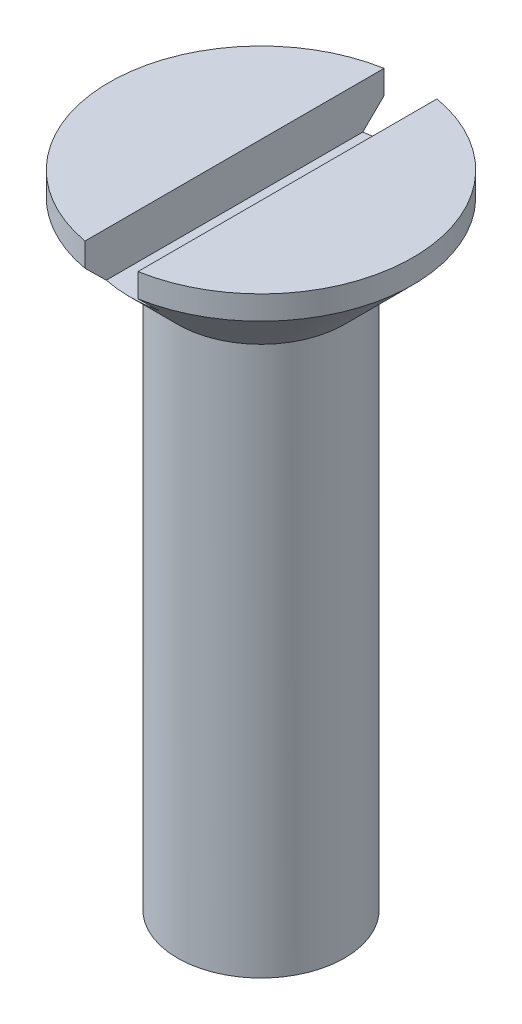
ISO-10303-21;
HEADER;
FILE_DESCRIPTION(('STEP AP214'),'2;1');
FILE_NAME('part.step','',(''),(''),'','','');
FILE_SCHEMA(('AUTOMOTIVE_DESIGN { 1 0 10303 214 1 1 1 1 }'));
ENDSEC;
DATA;
#1=APPLICATION_CONTEXT('core data for automotive mechanical design processes');
#2=APPLICATION_PROTOCOL_DEFINITION('international standard','automotive_design',2000,#1);
#3=PRODUCT_CONTEXT('',#1,'mechanical');
#4=PRODUCT('Part','Part','',(#3));
#5=PRODUCT_RELATED_PRODUCT_CATEGORY('part','',(#4));
#6=PRODUCT_DEFINITION_FORMATION('','',#4);
#7=PRODUCT_DEFINITION_CONTEXT('part definition',#1,'design');
#8=PRODUCT_DEFINITION('design','',#6,#7);
#9=PRODUCT_DEFINITION_SHAPE('','',#8);
#10=(LENGTH_UNIT() NAMED_UNIT(*) SI_UNIT(.MILLI.,.METRE.));
#11=(NAMED_UNIT(*) PLANE_ANGLE_UNIT() SI_UNIT($,.RADIAN.));
#12=(NAMED_UNIT(*) SI_UNIT($,.STERADIAN.) SOLID_ANGLE_UNIT());
#13=UNCERTAINTY_MEASURE_WITH_UNIT(LENGTH_MEASURE(1.E-05),#10,'distance_accuracy_value','');
#14=(GEOMETRIC_REPRESENTATION_CONTEXT(3) GLOBAL_UNCERTAINTY_ASSIGNED_CONTEXT((#13)) GLOBAL_UNIT_ASSIGNED_CONTEXT((#10,
#11,#12)) REPRESENTATION_CONTEXT('',''));
#15=CARTESIAN_POINT('',(0.,0.,0.));
#16=DIRECTION('',(0.,0.,1.));
#17=DIRECTION('',(1.,0.,0.));
#18=AXIS2_PLACEMENT_3D('',#15,#16,#17);
#19=CARTESIAN_POINT('',(0.,24.7320508075689,0.));
#20=DIRECTION('',(0.,1.,0.));
#21=DIRECTION('',(0.,0.,1.));
#22=AXIS2_PLACEMENT_3D('',#19,#20,#21);
#23=PLANE('',#22);
#24=DIRECTION('',(0.,0.,-1.));
#25=VECTOR('',#24,1.);
#26=CARTESIAN_POINT('',(0.95,24.7320508075689,-5.45));
#27=LINE('',#26,#25);
#28=CARTESIAN_POINT('',(0.95,24.7320508075689,5.3665631459995));
#29=VERTEX_POINT('',#28);
#30=CARTESIAN_POINT('',(0.95,24.7320508075689,-5.3665631459995));
#31=VERTEX_POINT('',#30);
#32=EDGE_CURVE('E156',#29,#31,#27,.T.);
#33=ORIENTED_EDGE('',*,*,#32,.F.);
#34=CARTESIAN_POINT('',(0.,24.7320508075689,0.));
#35=DIRECTION('',(0.,-1.,0.));
#36=DIRECTION('',(0.,0.,-1.));
#37=AXIS2_PLACEMENT_3D('',#34,#35,#36);
#38=CIRCLE('',#37,5.45);
#39=EDGE_CURVE('E104',#31,#29,#38,.T.);
#40=ORIENTED_EDGE('',*,*,#39,.F.);
#41=EDGE_LOOP('',(#33,#40));
#42=FACE_BOUND('',#41,.T.);
#43=ADVANCED_FACE('F37',(#42),#23,.T.);
#44=CARTESIAN_POINT('',(0.,0.,0.));
#45=DIRECTION('',(0.,-1.,0.));
#46=DIRECTION('',(0.,0.,-1.));
#47=AXIS2_PLACEMENT_3D('',#44,#45,#46);
#48=CYLINDRICAL_SURFACE('',#47,5.45);
#49=DIRECTION('',(0.,-1.,0.));
#50=VECTOR('',#49,1.);
#51=CARTESIAN_POINT('',(0.95,0.,5.3665631459995));
#52=LINE('',#51,#50);
#53=CARTESIAN_POINT('',(0.95,23.8820508075689,5.3665631459995));
#54=VERTEX_POINT('',#53);
#55=EDGE_CURVE('E152',#54,#29,#52,.F.);
#56=ORIENTED_EDGE('',*,*,#55,.F.);
#57=CARTESIAN_POINT('',(0.,23.8820508075689,0.));
#58=DIRECTION('',(0.,-1.,0.));
#59=DIRECTION('',(0.,0.,-1.));
#60=AXIS2_PLACEMENT_3D('',#57,#58,#59);
#61=CIRCLE('',#60,5.45);
#62=CARTESIAN_POINT('',(0.95,23.8820508075689,-5.3665631459995));
#63=VERTEX_POINT('',#62);
#64=EDGE_CURVE('E117',#63,#54,#61,.T.);
#65=ORIENTED_EDGE('',*,*,#64,.F.);
#66=DIRECTION('',(0.,-1.,0.));
#67=VECTOR('',#66,1.);
#68=CARTESIAN_POINT('',(0.95,0.,-5.3665631459995));
#69=LINE('',#68,#67);
#70=EDGE_CURVE('E153',#31,#63,#69,.T.);
#71=ORIENTED_EDGE('',*,*,#70,.F.);
#72=ORIENTED_EDGE('',*,*,#39,.T.);
#73=EDGE_LOOP('',(#56,#65,#71,#72));
#74=FACE_BOUND('',#73,.T.);
#75=ADVANCED_FACE('F151',(#74),#48,.T.);
#76=DIRECTION('',(0.,0.,1.));
#77=VECTOR('',#76,1.);
#78=CARTESIAN_POINT('',(-0.95,24.7320508075689,-5.45));
#79=LINE('',#78,#77);
#80=CARTESIAN_POINT('',(-0.95,24.7320508075689,-5.3665631459995));
#81=VERTEX_POINT('',#80);
#82=CARTESIAN_POINT('',(-0.95,24.7320508075689,5.3665631459995));
#83=VERTEX_POINT('',#82);
#84=EDGE_CURVE('E111',#81,#83,#79,.T.);
#85=ORIENTED_EDGE('',*,*,#84,.F.);
#86=EDGE_CURVE('E137',#83,#81,#38,.T.);
#87=ORIENTED_EDGE('',*,*,#86,.F.);
#88=EDGE_LOOP('',(#85,#87));
#89=FACE_BOUND('',#88,.T.);
#90=ADVANCED_FACE('F39',(#89),#23,.T.);
#91=DIRECTION('',(0.,-1.,0.));
#92=VECTOR('',#91,1.);
#93=CARTESIAN_POINT('',(-0.95,0.,-5.3665631459995));
#94=LINE('',#93,#92);
#95=CARTESIAN_POINT('',(-0.95,23.8820508075689,-5.3665631459995));
#96=VERTEX_POINT('',#95);
#97=EDGE_CURVE('E127',#96,#81,#94,.F.);
#98=ORIENTED_EDGE('',*,*,#97,.F.);
#99=CARTESIAN_POINT('',(-0.95,23.8820508075689,5.3665631459995));
#100=VERTEX_POINT('',#99);
#101=EDGE_CURVE('E135',#100,#96,#61,.T.);
#102=ORIENTED_EDGE('',*,*,#101,.F.);
#103=DIRECTION('',(0.,-1.,0.));
#104=VECTOR('',#103,1.);
#105=CARTESIAN_POINT('',(-0.95,0.,5.3665631459995));
#106=LINE('',#105,#104);
#107=EDGE_CURVE('E138',#83,#100,#106,.T.);
#108=ORIENTED_EDGE('',*,*,#107,.F.);
#109=ORIENTED_EDGE('',*,*,#86,.T.);
#110=EDGE_LOOP('',(#98,#102,#108,#109));
#111=FACE_BOUND('',#110,.T.);
#112=ADVANCED_FACE('F133',(#111),#48,.T.);
#113=CARTESIAN_POINT('',(0.,21.4320508075689,0.));
#114=DIRECTION('',(0.,1.,0.));
#115=DIRECTION('',(0.,0.,1.));
#116=AXIS2_PLACEMENT_3D('',#113,#114,#115);
#117=CONICAL_SURFACE('',#116,3.,0.785398163397443);
#118=CARTESIAN_POINT('',(0.95,23.8827508075689,-5.36727402784691));
#119=CARTESIAN_POINT('',(0.95,23.7386922721518,-5.22096942686692));
#120=CARTESIAN_POINT('',(0.95,23.594717816667,-5.07458190529039));
#121=CARTESIAN_POINT('',(0.95,23.3068609135357,-4.78142879407388));
#122=CARTESIAN_POINT('',(0.95,23.1629787018675,-4.63466297275422));
#123=CARTESIAN_POINT('',(0.95,22.8729592168232,-4.33821736729775));
#124=CARTESIAN_POINT('',(0.95,22.7268274090927,-4.18853223049867));
#125=CARTESIAN_POINT('',(0.95,22.435146779317,-3.88888624809531));
#126=CARTESIAN_POINT('',(0.95,22.2895975209458,-3.73892582684179));
#127=CARTESIAN_POINT('',(0.95,21.916193962948,-3.35268732026558));
#128=CARTESIAN_POINT('',(0.95,21.6887724862301,-3.11598875256886));
#129=CARTESIAN_POINT('',(0.95,21.3493161636398,-2.75849636400412));
#130=CARTESIAN_POINT('',(0.95,21.236233748065,-2.63869876965934));
#131=CARTESIAN_POINT('',(0.95,21.0111737581749,-2.3981635782147));
#132=CARTESIAN_POINT('',(0.95,20.8991957385827,-2.27742639827611));
#133=CARTESIAN_POINT('',(0.95,20.67853218465,-2.03630430512405));
#134=CARTESIAN_POINT('',(0.95,20.5698224677066,-1.91594166741531));
#135=CARTESIAN_POINT('',(0.95,20.4086407792311,-1.73355249406456));
#136=CARTESIAN_POINT('',(0.95,20.3551840995162,-1.67239741852466));
#137=CARTESIAN_POINT('',(0.95,20.249165055603,-1.54931822073712));
#138=CARTESIAN_POINT('',(0.95,20.1966026596036,-1.48739412597211));
#139=CARTESIAN_POINT('',(0.95,20.0930614832441,-1.36295298776711));
#140=CARTESIAN_POINT('',(0.95,20.0420742864828,-1.30044297031367));
#141=CARTESIAN_POINT('',(0.95,19.9418276633198,-1.17405781364909));
#142=CARTESIAN_POINT('',(0.95,19.8925679501324,-1.11018290388927));
#143=CARTESIAN_POINT('',(0.95,19.7967350308804,-0.980693167144421));
#144=CARTESIAN_POINT('',(0.95,19.7501552486259,-0.915083231273152));
#145=CARTESIAN_POINT('',(0.95,19.6609914342475,-0.781218199399263));
#146=CARTESIAN_POINT('',(0.95,19.618403216848,-0.71296598249865));
#147=CARTESIAN_POINT('',(0.95,19.5703966295173,-0.627290830226435));
#148=CARTESIAN_POINT('',(0.95,19.5618340282278,-0.611626968875247));
#149=CARTESIAN_POINT('',(0.95,19.5450800386999,-0.580097704625376));
#150=CARTESIAN_POINT('',(0.95,19.5368887334949,-0.564232257651601));
#151=CARTESIAN_POINT('',(0.95,19.5129403370542,-0.5163213457694));
#152=CARTESIAN_POINT('',(0.95,19.4978072513411,-0.483958640203391));
#153=CARTESIAN_POINT('',(0.95,19.4697969259773,-0.418661506764507));
#154=CARTESIAN_POINT('',(0.95,19.4568978648198,-0.38573652355217));
#155=CARTESIAN_POINT('',(0.95,19.4336823191761,-0.318972916981183));
#156=CARTESIAN_POINT('',(0.95,19.423365703705,-0.285134340057605));
#157=CARTESIAN_POINT('',(0.95,19.4076506612621,-0.223588326667061));
#158=CARTESIAN_POINT('',(0.95,19.4016792467842,-0.19602795395452));
#159=CARTESIAN_POINT('',(0.95,19.3919977769264,-0.140515145544492));
#160=CARTESIAN_POINT('',(0.95,19.3882870461112,-0.112562829505704));
#161=CARTESIAN_POINT('',(0.95,19.3833197960642,-0.0564821272998768));
#162=CARTESIAN_POINT('',(0.95,19.3820592916309,-0.0283541018134364));
#163=CARTESIAN_POINT('',(0.95,19.3820423759,0.0279054650456543));
#164=CARTESIAN_POINT('',(0.95,19.3832867874644,0.0560370045371295));
#165=CARTESIAN_POINT('',(0.95,19.3906963468661,0.139905474855344));
#166=CARTESIAN_POINT('',(0.95,19.4005174291714,0.195353553361763));
#167=CARTESIAN_POINT('',(0.95,19.4212392064539,0.276951858970861));
#168=CARTESIAN_POINT('',(0.95,19.4291644088802,0.30393587079854));
#169=CARTESIAN_POINT('',(0.95,19.4467256687551,0.357345323945092));
#170=CARTESIAN_POINT('',(0.95,19.456361666027,0.383770784874281));
#171=CARTESIAN_POINT('',(0.95,19.4957011628006,0.483109331771258));
#172=CARTESIAN_POINT('',(0.95,19.5303028877265,0.55407284224865));
#173=CARTESIAN_POINT('',(0.95,19.6061625731116,0.692377095293868));
#174=CARTESIAN_POINT('',(0.95,19.6474376281943,0.759707925194212));
#175=CARTESIAN_POINT('',(0.95,19.7343854179115,0.89223674683564));
#176=CARTESIAN_POINT('',(0.95,19.7800915767686,0.957412601266816));
#177=CARTESIAN_POINT('',(0.95,19.8505882475633,1.05366873930194));
#178=CARTESIAN_POINT('',(0.95,19.8743949875735,1.08548396626284));
#179=CARTESIAN_POINT('',(0.95,19.922551488408,1.14870022001975));
#180=CARTESIAN_POINT('',(0.95,19.9469012306485,1.18010126093261));
#181=CARTESIAN_POINT('',(0.95,20.0273738276733,1.2823758776929));
#182=CARTESIAN_POINT('',(0.95,20.0844183667244,1.35252327414228));
#183=CARTESIAN_POINT('',(0.95,20.2000309270027,1.49155447486916));
#184=CARTESIAN_POINT('',(0.95,20.2585991238414,1.56043813191833));
#185=CARTESIAN_POINT('',(0.95,20.3768251389198,1.69730257484196));
#186=CARTESIAN_POINT('',(0.95,20.4364833187204,1.7652830477126));
#187=CARTESIAN_POINT('',(0.95,20.5565815335224,1.90055074738837));
#188=CARTESIAN_POINT('',(0.95,20.617021586832,1.96783795789364));
#189=CARTESIAN_POINT('',(0.95,20.799374809316,2.1690965912155));
#190=CARTESIAN_POINT('',(0.95,20.9221580795637,2.30227879707874));
#191=CARTESIAN_POINT('',(0.95,21.1690834272463,2.56731989942238));
#192=CARTESIAN_POINT('',(0.95,21.2932252221137,2.69917906055061));
#193=CARTESIAN_POINT('',(0.95,21.5418318353519,2.96141357028911));
#194=CARTESIAN_POINT('',(0.95,21.6662923693902,3.0917929839183));
#195=CARTESIAN_POINT('',(0.95,21.9158420326703,3.35196093172158));
#196=CARTESIAN_POINT('',(0.95,22.0409311942095,3.48174943486929));
#197=CARTESIAN_POINT('',(0.95,22.4167068941813,3.87032055879073));
#198=CARTESIAN_POINT('',(0.95,22.668051860438,4.12846624524083));
#199=CARTESIAN_POINT('',(0.95,22.9998952872818,4.46799564927124));
#200=CARTESIAN_POINT('',(0.95,23.0799544519793,4.54981026078764));
#201=CARTESIAN_POINT('',(0.95,23.2401699023128,4.713362308312));
#202=CARTESIAN_POINT('',(0.95,23.3203261977901,4.79509973468867));
#203=CARTESIAN_POINT('',(0.95,23.4808277419137,4.95861796157239));
#204=CARTESIAN_POINT('',(0.95,23.5611730969813,5.0403986575763));
#205=CARTESIAN_POINT('',(0.95,23.7219199630661,5.20388671182275));
#206=CARTESIAN_POINT('',(0.95,23.8023214667313,5.28559407729381));
#207=CARTESIAN_POINT('',(0.95,23.8827508075689,5.36727402784691));
#208=B_SPLINE_CURVE_WITH_KNOTS('',3,(#118,#119,#120,#121,#122,#123,#124,#125,#126,#127,#128,
#129,#130,#131,#132,#133,#134,#135,#136,#137,#138,#139,#140,#141,#142,#143,#144,#145,#146,#147,
#148,#149,#150,#151,#152,#153,#154,#155,#156,#157,#158,#159,#160,#161,#162,#163,#164,#165,#166,
#167,#168,#169,#170,#171,#172,#173,#174,#175,#176,#177,#178,#179,#180,#181,#182,#183,#184,#185,
#186,#187,#188,#189,#190,#191,#192,#193,#194,#195,#196,#197,#198,#199,#200,#201,#202,#203,#204,
#205,#206,#207),.UNSPECIFIED.,.F.,.F.,(4,2,2,2,2,2,2,2,2,2,2,2,2,2,2,2,2,2,2,2,2,2,2,2,2,2,2,2,
2,2,2,2,2,2,2,2,2,2,2,2,2,2,2,2,4),(0.,0.615971733476583,1.23255943239411,1.86012628446736,
2.48706670861854,3.47179557281984,3.96600953924985,4.46001535278199,4.94655187034503,
5.19022198069896,5.43388340786631,5.67586585560888,5.91780793896075,6.15912850734742,
6.4001931448015,6.45374310913537,6.50730499041661,6.61441955613181,6.72042026818556,
6.8264156026644,6.91093252340633,6.99542418022095,7.07977829915208,7.16416013283658,
7.33221931503605,7.4165513342557,7.50088038770464,7.73701700389003,7.97376838906794,
8.21246995736465,8.33167593620551,8.45087784155274,8.72208373607496,8.99332102854831,
9.26464998888789,9.53598531416901,10.079398208818,10.622700146502,11.1634398873133,
11.7042077001592,12.7850905081255,13.1284969121904,13.4719416386942,13.8158763771414,
14.1597723411595),.UNSPECIFIED.);
#209=CARTESIAN_POINT('',(0.95,23.1320508075689,-4.60298815988047));
#210=VERTEX_POINT('',#209);
#211=EDGE_CURVE('E11',#63,#210,#208,.T.);
#212=ORIENTED_EDGE('',*,*,#211,.F.);
#213=ORIENTED_EDGE('',*,*,#64,.T.);
#214=CARTESIAN_POINT('',(0.95,23.1320508075689,4.60298815988047));
#215=VERTEX_POINT('',#214);
#216=EDGE_CURVE('E41',#215,#54,#208,.T.);
#217=ORIENTED_EDGE('',*,*,#216,.F.);
#218=CARTESIAN_POINT('',(0.,23.1320508075689,0.));
#219=DIRECTION('',(0.,1.,0.));
#220=DIRECTION('',(0.,0.,1.));
#221=AXIS2_PLACEMENT_3D('',#218,#219,#220);
#222=CIRCLE('',#221,4.69999999999998);
#223=CARTESIAN_POINT('',(-0.95,23.1320508075689,4.60298815988047));
#224=VERTEX_POINT('',#223);
#225=EDGE_CURVE('E95',#215,#224,#222,.F.);
#226=ORIENTED_EDGE('',*,*,#225,.T.);
#227=CARTESIAN_POINT('',(-0.95,23.8827508075689,5.36727402784691));
#228=CARTESIAN_POINT('',(-0.95,23.7386922721518,5.22096942686692));
#229=CARTESIAN_POINT('',(-0.95,23.594717816667,5.07458190529039));
#230=CARTESIAN_POINT('',(-0.95,23.3068609135357,4.78142879407388));
#231=CARTESIAN_POINT('',(-0.95,23.1629787018675,4.63466297275422));
#232=CARTESIAN_POINT('',(-0.95,22.8729592168232,4.33821736729775));
#233=CARTESIAN_POINT('',(-0.95,22.7268274090927,4.18853223049867));
#234=CARTESIAN_POINT('',(-0.95,22.435146779317,3.88888624809531));
#235=CARTESIAN_POINT('',(-0.95,22.2895975209458,3.73892582684179));
#236=CARTESIAN_POINT('',(-0.95,21.916193962948,3.35268732026558));
#237=CARTESIAN_POINT('',(-0.95,21.6887724862301,3.11598875256886));
#238=CARTESIAN_POINT('',(-0.95,21.3493161636398,2.75849636400412));
#239=CARTESIAN_POINT('',(-0.95,21.236233748065,2.63869876965934));
#240=CARTESIAN_POINT('',(-0.95,21.0111737581749,2.3981635782147));
#241=CARTESIAN_POINT('',(-0.95,20.8991957385827,2.27742639827611));
#242=CARTESIAN_POINT('',(-0.95,20.67853218465,2.03630430512405));
#243=CARTESIAN_POINT('',(-0.95,20.5698224677066,1.91594166741531));
#244=CARTESIAN_POINT('',(-0.95,20.4086407792311,1.73355249406456));
#245=CARTESIAN_POINT('',(-0.95,20.3551840995162,1.67239741852466));
#246=CARTESIAN_POINT('',(-0.95,20.249165055603,1.54931822073712));
#247=CARTESIAN_POINT('',(-0.95,20.1966026596036,1.48739412597211));
#248=CARTESIAN_POINT('',(-0.95,20.0930614832441,1.36295298776711));
#249=CARTESIAN_POINT('',(-0.95,20.0420742864828,1.30044297031367));
#250=CARTESIAN_POINT('',(-0.95,19.9418276633198,1.17405781364909));
#251=CARTESIAN_POINT('',(-0.95,19.8925679501324,1.11018290388927));
#252=CARTESIAN_POINT('',(-0.95,19.7967350308804,0.980693167144421));
#253=CARTESIAN_POINT('',(-0.95,19.7501552486259,0.915083231273152));
#254=CARTESIAN_POINT('',(-0.95,19.6609914342475,0.781218199399263));
#255=CARTESIAN_POINT('',(-0.95,19.618403216848,0.71296598249865));
#256=CARTESIAN_POINT('',(-0.95,19.5703966295173,0.627290830226435));
#257=CARTESIAN_POINT('',(-0.95,19.5618340282278,0.611626968875247));
#258=CARTESIAN_POINT('',(-0.95,19.5450800386999,0.580097704625376));
#259=CARTESIAN_POINT('',(-0.95,19.5368887334949,0.564232257651601));
#260=CARTESIAN_POINT('',(-0.95,19.5129403370542,0.5163213457694));
#261=CARTESIAN_POINT('',(-0.95,19.4978072513411,0.483958640203391));
#262=CARTESIAN_POINT('',(-0.95,19.4697969259773,0.418661506764507));
#263=CARTESIAN_POINT('',(-0.95,19.4568978648198,0.38573652355217));
#264=CARTESIAN_POINT('',(-0.95,19.4336823191761,0.318972916981183));
#265=CARTESIAN_POINT('',(-0.95,19.423365703705,0.285134340057605));
#266=CARTESIAN_POINT('',(-0.95,19.4076506612621,0.223588326667061));
#267=CARTESIAN_POINT('',(-0.95,19.4016792467842,0.19602795395452));
#268=CARTESIAN_POINT('',(-0.95,19.3919977769264,0.140515145544492));
#269=CARTESIAN_POINT('',(-0.95,19.3882870461112,0.112562829505704));
#270=CARTESIAN_POINT('',(-0.95,19.3833197960642,0.0564821272998768));
#271=CARTESIAN_POINT('',(-0.95,19.3820592916309,0.0283541018134364));
#272=CARTESIAN_POINT('',(-0.95,19.3820423759,-0.0279054650456543));
#273=CARTESIAN_POINT('',(-0.95,19.3832867874644,-0.0560370045371295));
#274=CARTESIAN_POINT('',(-0.95,19.3906963468661,-0.139905474855344));
#275=CARTESIAN_POINT('',(-0.95,19.4005174291714,-0.195353553361763));
#276=CARTESIAN_POINT('',(-0.95,19.4212392064539,-0.276951858970861));
#277=CARTESIAN_POINT('',(-0.95,19.4291644088802,-0.30393587079854));
#278=CARTESIAN_POINT('',(-0.95,19.4467256687551,-0.357345323945092));
#279=CARTESIAN_POINT('',(-0.95,19.456361666027,-0.383770784874281));
#280=CARTESIAN_POINT('',(-0.95,19.4957011628006,-0.483109331771258));
#281=CARTESIAN_POINT('',(-0.95,19.5303028877265,-0.55407284224865));
#282=CARTESIAN_POINT('',(-0.95,19.6061625731116,-0.692377095293868));
#283=CARTESIAN_POINT('',(-0.95,19.6474376281943,-0.759707925194212));
#284=CARTESIAN_POINT('',(-0.95,19.7343854179115,-0.89223674683564));
#285=CARTESIAN_POINT('',(-0.95,19.7800915767686,-0.957412601266816));
#286=CARTESIAN_POINT('',(-0.95,19.8505882475633,-1.05366873930194));
#287=CARTESIAN_POINT('',(-0.95,19.8743949875735,-1.08548396626284));
#288=CARTESIAN_POINT('',(-0.95,19.922551488408,-1.14870022001975));
#289=CARTESIAN_POINT('',(-0.95,19.9469012306485,-1.18010126093261));
#290=CARTESIAN_POINT('',(-0.95,20.0273738276733,-1.2823758776929));
#291=CARTESIAN_POINT('',(-0.95,20.0844183667244,-1.35252327414228));
#292=CARTESIAN_POINT('',(-0.95,20.2000309270027,-1.49155447486916));
#293=CARTESIAN_POINT('',(-0.95,20.2585991238414,-1.56043813191833));
#294=CARTESIAN_POINT('',(-0.95,20.3768251389198,-1.69730257484196));
#295=CARTESIAN_POINT('',(-0.95,20.4364833187204,-1.7652830477126));
#296=CARTESIAN_POINT('',(-0.95,20.5565815335224,-1.90055074738837));
#297=CARTESIAN_POINT('',(-0.95,20.617021586832,-1.96783795789364));
#298=CARTESIAN_POINT('',(-0.95,20.799374809316,-2.1690965912155));
#299=CARTESIAN_POINT('',(-0.95,20.9221580795637,-2.30227879707874));
#300=CARTESIAN_POINT('',(-0.95,21.1690834272463,-2.56731989942238));
#301=CARTESIAN_POINT('',(-0.95,21.2932252221137,-2.69917906055061));
#302=CARTESIAN_POINT('',(-0.95,21.5418318353519,-2.96141357028911));
#303=CARTESIAN_POINT('',(-0.95,21.6662923693902,-3.0917929839183));
#304=CARTESIAN_POINT('',(-0.95,21.9158420326703,-3.35196093172158));
#305=CARTESIAN_POINT('',(-0.95,22.0409311942095,-3.48174943486929));
#306=CARTESIAN_POINT('',(-0.95,22.4167068941813,-3.87032055879073));
#307=CARTESIAN_POINT('',(-0.95,22.668051860438,-4.12846624524083));
#308=CARTESIAN_POINT('',(-0.95,22.9998952872818,-4.46799564927124));
#309=CARTESIAN_POINT('',(-0.95,23.0799544519793,-4.54981026078764));
#310=CARTESIAN_POINT('',(-0.95,23.2401699023128,-4.713362308312));
#311=CARTESIAN_POINT('',(-0.95,23.3203261977901,-4.79509973468867));
#312=CARTESIAN_POINT('',(-0.95,23.4808277419137,-4.95861796157239));
#313=CARTESIAN_POINT('',(-0.95,23.5611730969813,-5.0403986575763));
#314=CARTESIAN_POINT('',(-0.95,23.7219199630661,-5.20388671182275));
#315=CARTESIAN_POINT('',(-0.95,23.8023214667313,-5.28559407729381));
#316=CARTESIAN_POINT('',(-0.95,23.8827508075689,-5.36727402784691));
#317=B_SPLINE_CURVE_WITH_KNOTS('',3,(#227,#228,#229,#230,#231,#232,#233,#234,#235,#236,#237,
#238,#239,#240,#241,#242,#243,#244,#245,#246,#247,#248,#249,#250,#251,#252,#253,#254,#255,#256,
#257,#258,#259,#260,#261,#262,#263,#264,#265,#266,#267,#268,#269,#270,#271,#272,#273,#274,#275,
#276,#277,#278,#279,#280,#281,#282,#283,#284,#285,#286,#287,#288,#289,#290,#291,#292,#293,#294,
#295,#296,#297,#298,#299,#300,#301,#302,#303,#304,#305,#306,#307,#308,#309,#310,#311,#312,#313,
#314,#315,#316),.UNSPECIFIED.,.F.,.F.,(4,2,2,2,2,2,2,2,2,2,2,2,2,2,2,2,2,2,2,2,2,2,2,2,2,2,2,2,
2,2,2,2,2,2,2,2,2,2,2,2,2,2,2,2,4),(0.,0.615971733476583,1.23255943239411,1.86012628446736,
2.48706670861854,3.47179557281984,3.96600953924985,4.46001535278199,4.94655187034503,
5.19022198069896,5.43388340786631,5.67586585560888,5.91780793896075,6.15912850734742,
6.4001931448015,6.45374310913537,6.50730499041661,6.61441955613181,6.72042026818556,
6.8264156026644,6.91093252340633,6.99542418022095,7.07977829915208,7.16416013283658,
7.33221931503605,7.4165513342557,7.50088038770464,7.73701700389003,7.97376838906794,
8.21246995736465,8.33167593620551,8.45087784155274,8.72208373607496,8.99332102854831,
9.26464998888789,9.53598531416901,10.079398208818,10.622700146502,11.1634398873133,
11.7042077001592,12.7850905081255,13.1284969121904,13.4719416386942,13.8158763771414,
14.1597723411595),.UNSPECIFIED.);
#318=EDGE_CURVE('E103',#100,#224,#317,.T.);
#319=ORIENTED_EDGE('',*,*,#318,.F.);
#320=ORIENTED_EDGE('',*,*,#101,.T.);
#321=CARTESIAN_POINT('',(-0.95,23.1320508075689,-4.60298815988047));
#322=VERTEX_POINT('',#321);
#323=EDGE_CURVE('E52',#322,#96,#317,.T.);
#324=ORIENTED_EDGE('',*,*,#323,.F.);
#325=EDGE_CURVE('E106',#322,#210,#222,.F.);
#326=ORIENTED_EDGE('',*,*,#325,.T.);
#327=EDGE_LOOP('',(#212,#213,#217,#226,#319,#320,#324,#326));
#328=FACE_BOUND('',#327,.T.);
#329=CARTESIAN_POINT('',(0.,21.4320508075689,0.));
#330=DIRECTION('',(0.,-1.,0.));
#331=DIRECTION('',(0.,0.,-1.));
#332=AXIS2_PLACEMENT_3D('',#329,#330,#331);
#333=CIRCLE('',#332,3.);
#334=CARTESIAN_POINT('',(0.,21.4320508075689,-3.));
#335=VERTEX_POINT('',#334);
#336=EDGE_CURVE('E140',#335,#335,#333,.T.);
#337=ORIENTED_EDGE('',*,*,#336,.F.);
#338=EDGE_LOOP('',(#337));
#339=FACE_BOUND('',#338,.T.);
#340=ADVANCED_FACE('F114',(#328,#339),#117,.T.);
#341=CARTESIAN_POINT('',(0.,0.,0.));
#342=DIRECTION('',(0.,-1.,0.));
#343=DIRECTION('',(0.,0.,-1.));
#344=AXIS2_PLACEMENT_3D('',#341,#342,#343);
#345=CYLINDRICAL_SURFACE('',#344,3.);
#346=ORIENTED_EDGE('',*,*,#336,.T.);
#347=EDGE_LOOP('',(#346));
#348=FACE_BOUND('',#347,.T.);
#349=CARTESIAN_POINT('',(0.,1.7320508075689,0.));
#350=DIRECTION('',(0.,-1.,0.));
#351=DIRECTION('',(0.,0.,-1.));
#352=AXIS2_PLACEMENT_3D('',#349,#350,#351);
#353=CIRCLE('',#352,3.);
#354=CARTESIAN_POINT('',(0.,1.7320508075689,-3.));
#355=VERTEX_POINT('',#354);
#356=EDGE_CURVE('E143',#355,#355,#353,.T.);
#357=ORIENTED_EDGE('',*,*,#356,.F.);
#358=EDGE_LOOP('',(#357));
#359=FACE_BOUND('',#358,.T.);
#360=ADVANCED_FACE('F168',(#348,#359),#345,.T.);
#361=CARTESIAN_POINT('',(0.,0.,0.));
#362=DIRECTION('',(0.,1.,0.));
#363=DIRECTION('',(0.,0.,1.));
#364=AXIS2_PLACEMENT_3D('',#361,#362,#363);
#365=CONICAL_SURFACE('',#364,0.,1.04719755119659);
#366=ORIENTED_EDGE('',*,*,#356,.T.);
#367=EDGE_LOOP('',(#366));
#368=FACE_BOUND('',#367,.T.);
#369=CARTESIAN_POINT('',(0.,0.,0.));
#370=VERTEX_POINT('',#369);
#371=VERTEX_LOOP('',#370);
#372=FACE_BOUND('',#371,.T.);
#373=ADVANCED_FACE('F166',(#368,#372),#365,.T.);
#374=CARTESIAN_POINT('',(0.95,23.1320508075689,-5.45));
#375=DIRECTION('',(1.,0.,0.));
#376=DIRECTION('',(0.,0.,-1.));
#377=AXIS2_PLACEMENT_3D('',#374,#375,#376);
#378=PLANE('',#377);
#379=ORIENTED_EDGE('',*,*,#70,.T.);
#380=ORIENTED_EDGE('',*,*,#211,.T.);
#381=DIRECTION('',(0.,0.,-1.));
#382=VECTOR('',#381,1.);
#383=CARTESIAN_POINT('',(0.95,23.1320508075689,-5.45));
#384=LINE('',#383,#382);
#385=EDGE_CURVE('E98',#215,#210,#384,.T.);
#386=ORIENTED_EDGE('',*,*,#385,.F.);
#387=ORIENTED_EDGE('',*,*,#216,.T.);
#388=ORIENTED_EDGE('',*,*,#55,.T.);
#389=ORIENTED_EDGE('',*,*,#32,.T.);
#390=EDGE_LOOP('',(#379,#380,#386,#387,#388,#389));
#391=FACE_BOUND('',#390,.T.);
#392=ADVANCED_FACE('F108',(#391),#378,.F.);
#393=CARTESIAN_POINT('',(-0.95,23.1320508075689,-5.45));
#394=DIRECTION('',(-1.,0.,0.));
#395=DIRECTION('',(0.,0.,1.));
#396=AXIS2_PLACEMENT_3D('',#393,#394,#395);
#397=PLANE('',#396);
#398=ORIENTED_EDGE('',*,*,#107,.T.);
#399=ORIENTED_EDGE('',*,*,#318,.T.);
#400=DIRECTION('',(0.,0.,1.));
#401=VECTOR('',#400,1.);
#402=CARTESIAN_POINT('',(-0.95,23.1320508075689,-5.45));
#403=LINE('',#402,#401);
#404=EDGE_CURVE('E59',#322,#224,#403,.T.);
#405=ORIENTED_EDGE('',*,*,#404,.F.);
#406=ORIENTED_EDGE('',*,*,#323,.T.);
#407=ORIENTED_EDGE('',*,*,#97,.T.);
#408=ORIENTED_EDGE('',*,*,#84,.T.);
#409=EDGE_LOOP('',(#398,#399,#405,#406,#407,#408));
#410=FACE_BOUND('',#409,.T.);
#411=ADVANCED_FACE('F126',(#410),#397,.F.);
#412=CARTESIAN_POINT('',(0.,23.1320508075689,0.));
#413=DIRECTION('',(0.,1.,0.));
#414=DIRECTION('',(0.,0.,1.));
#415=AXIS2_PLACEMENT_3D('',#412,#413,#414);
#416=PLANE('',#415);
#417=ORIENTED_EDGE('',*,*,#404,.T.);
#418=ORIENTED_EDGE('',*,*,#225,.F.);
#419=ORIENTED_EDGE('',*,*,#385,.T.);
#420=ORIENTED_EDGE('',*,*,#325,.F.);
#421=EDGE_LOOP('',(#417,#418,#419,#420));
#422=FACE_BOUND('',#421,.T.);
#423=ADVANCED_FACE('F97',(#422),#416,.T.);
#424=CLOSED_SHELL('',(#43,#75,#90,#112,#340,#360,#373,#392,#411,#423));
#425=MANIFOLD_SOLID_BREP('B2',#424);
#426=ADVANCED_BREP_SHAPE_REPRESENTATION('',(#18,#425),#14);
#427=SHAPE_DEFINITION_REPRESENTATION(#9,#426);
ENDSEC;
END-ISO-10303-21;
